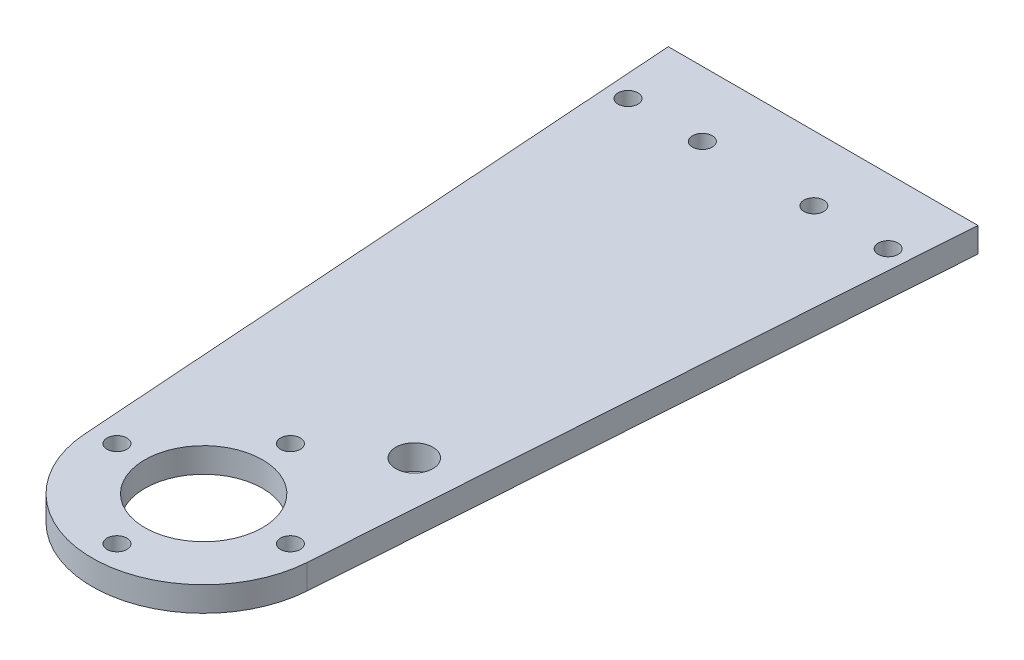
ISO-10303-21;
HEADER;
FILE_DESCRIPTION(('STEP AP214'),'2;1');
FILE_NAME('part.step','',(''),(''),'','','');
FILE_SCHEMA(('AUTOMOTIVE_DESIGN { 1 0 10303 214 1 1 1 1 }'));
ENDSEC;
DATA;
#1=APPLICATION_CONTEXT('core data for automotive mechanical design processes');
#2=APPLICATION_PROTOCOL_DEFINITION('international standard','automotive_design',2000,#1);
#3=PRODUCT_CONTEXT('',#1,'mechanical');
#4=PRODUCT('Part','Part','',(#3));
#5=PRODUCT_RELATED_PRODUCT_CATEGORY('part','',(#4));
#6=PRODUCT_DEFINITION_FORMATION('','',#4);
#7=PRODUCT_DEFINITION_CONTEXT('part definition',#1,'design');
#8=PRODUCT_DEFINITION('design','',#6,#7);
#9=PRODUCT_DEFINITION_SHAPE('','',#8);
#10=(LENGTH_UNIT() NAMED_UNIT(*) SI_UNIT(.MILLI.,.METRE.));
#11=(NAMED_UNIT(*) PLANE_ANGLE_UNIT() SI_UNIT($,.RADIAN.));
#12=(NAMED_UNIT(*) SI_UNIT($,.STERADIAN.) SOLID_ANGLE_UNIT());
#13=UNCERTAINTY_MEASURE_WITH_UNIT(LENGTH_MEASURE(1.E-05),#10,'distance_accuracy_value','');
#14=(GEOMETRIC_REPRESENTATION_CONTEXT(3) GLOBAL_UNCERTAINTY_ASSIGNED_CONTEXT((#13)) GLOBAL_UNIT_ASSIGNED_CONTEXT((#10,
#11,#12)) REPRESENTATION_CONTEXT('',''));
#15=CARTESIAN_POINT('',(0.,0.,0.));
#16=DIRECTION('',(0.,0.,1.));
#17=DIRECTION('',(1.,0.,0.));
#18=AXIS2_PLACEMENT_3D('',#15,#16,#17);
#19=CARTESIAN_POINT('',(0.,4.,0.));
#20=DIRECTION('',(0.,1.,0.));
#21=DIRECTION('',(0.,0.,-1.));
#22=AXIS2_PLACEMENT_3D('',#19,#20,#21);
#23=PLANE('',#22);
#24=CARTESIAN_POINT('',(-9.00000000000125,4.,-89.5));
#25=DIRECTION('',(0.,-1.,0.));
#26=DIRECTION('',(0.,0.,-1.));
#27=AXIS2_PLACEMENT_3D('',#24,#25,#26);
#28=CIRCLE('',#27,1.59999999999982);
#29=CARTESIAN_POINT('',(-9.00000000000125,4.,-91.0999999999999));
#30=VERTEX_POINT('',#29);
#31=EDGE_CURVE('E158',#30,#30,#28,.T.);
#32=ORIENTED_EDGE('',*,*,#31,.T.);
#33=EDGE_LOOP('',(#32));
#34=FACE_BOUND('',#33,.T.);
#35=CARTESIAN_POINT('',(20.9999999999977,4.,-89.5));
#36=DIRECTION('',(0.,-1.,0.));
#37=DIRECTION('',(0.,0.,-1.));
#38=AXIS2_PLACEMENT_3D('',#35,#36,#37);
#39=CIRCLE('',#38,1.59999999999982);
#40=CARTESIAN_POINT('',(20.9999999999977,4.,-91.0999999999999));
#41=VERTEX_POINT('',#40);
#42=EDGE_CURVE('E146',#41,#41,#39,.T.);
#43=ORIENTED_EDGE('',*,*,#42,.T.);
#44=EDGE_LOOP('',(#43));
#45=FACE_BOUND('',#44,.T.);
#46=CARTESIAN_POINT('',(-1.34766330039948E-12,4.,14.));
#47=DIRECTION('',(0.,-1.,0.));
#48=DIRECTION('',(0.,0.,-1.));
#49=AXIS2_PLACEMENT_3D('',#46,#47,#48);
#50=CIRCLE('',#49,1.59999999999982);
#51=CARTESIAN_POINT('',(-1.34766330039948E-12,4.,12.4000000000002));
#52=VERTEX_POINT('',#51);
#53=EDGE_CURVE('E134',#52,#52,#50,.T.);
#54=ORIENTED_EDGE('',*,*,#53,.T.);
#55=EDGE_LOOP('',(#54));
#56=FACE_BOUND('',#55,.T.);
#57=CARTESIAN_POINT('',(-4.59484880699357E-13,4.,-14.));
#58=DIRECTION('',(0.,-1.,0.));
#59=DIRECTION('',(0.,0.,-1.));
#60=AXIS2_PLACEMENT_3D('',#57,#58,#59);
#61=CIRCLE('',#60,1.59999999999982);
#62=CARTESIAN_POINT('',(-4.59484880699357E-13,4.,-15.5999999999998));
#63=VERTEX_POINT('',#62);
#64=EDGE_CURVE('E122',#63,#63,#61,.T.);
#65=ORIENTED_EDGE('',*,*,#64,.T.);
#66=EDGE_LOOP('',(#65));
#67=FACE_BOUND('',#66,.T.);
#68=CARTESIAN_POINT('',(0.,4.,0.));
#69=DIRECTION('',(0.,-1.,0.));
#70=DIRECTION('',(0.,0.,-1.));
#71=AXIS2_PLACEMENT_3D('',#68,#69,#70);
#72=CIRCLE('',#71,9.49999999999872);
#73=CARTESIAN_POINT('',(0.,4.,-9.49999999999872));
#74=VERTEX_POINT('',#73);
#75=EDGE_CURVE('E105',#74,#74,#72,.T.);
#76=ORIENTED_EDGE('',*,*,#75,.T.);
#77=EDGE_LOOP('',(#76));
#78=FACE_BOUND('',#77,.T.);
#79=CARTESIAN_POINT('',(0.,4.,0.));
#80=DIRECTION('',(0.,-1.,0.));
#81=DIRECTION('',(0.,0.,-1.));
#82=AXIS2_PLACEMENT_3D('',#79,#80,#81);
#83=CIRCLE('',#82,18.000000000004);
#84=CARTESIAN_POINT('',(17.9566038512915,4.,1.2491509628253));
#85=VERTEX_POINT('',#84);
#86=CARTESIAN_POINT('',(-17.9566038512915,4.,1.24915096282486));
#87=VERTEX_POINT('',#86);
#88=EDGE_CURVE('E93',#85,#87,#83,.T.);
#89=ORIENTED_EDGE('',*,*,#88,.F.);
#90=DIRECTION('',(-0.0693972757122852,0.,0.997589102849321));
#91=VECTOR('',#90,1.);
#92=CARTESIAN_POINT('',(17.9566038512915,4.,1.2491509628253));
#93=LINE('',#92,#91);
#94=CARTESIAN_POINT('',(24.9999999999995,4.,-99.9999999999996));
#95=VERTEX_POINT('',#94);
#96=EDGE_CURVE('E96',#95,#85,#93,.T.);
#97=ORIENTED_EDGE('',*,*,#96,.F.);
#98=DIRECTION('',(1.,0.,0.));
#99=VECTOR('',#98,1.);
#100=CARTESIAN_POINT('',(-25.0000000000013,4.,-99.9999999999996));
#101=LINE('',#100,#99);
#102=CARTESIAN_POINT('',(-25.0000000000013,4.,-99.9999999999996));
#103=VERTEX_POINT('',#102);
#104=EDGE_CURVE('E84',#103,#95,#101,.T.);
#105=ORIENTED_EDGE('',*,*,#104,.F.);
#106=DIRECTION('',(-0.0693972757123029,0.,-0.99758910284932));
#107=VECTOR('',#106,1.);
#108=CARTESIAN_POINT('',(-17.9566038512915,4.,1.24915096282486));
#109=LINE('',#108,#107);
#110=EDGE_CURVE('E89',#87,#103,#109,.T.);
#111=ORIENTED_EDGE('',*,*,#110,.F.);
#112=EDGE_LOOP('',(#89,#97,#105,#111));
#113=FACE_BOUND('',#112,.T.);
#114=CARTESIAN_POINT('',(-14.0000000000007,4.,-4.37150315946155E-13));
#115=DIRECTION('',(0.,-1.,0.));
#116=DIRECTION('',(0.,0.,-1.));
#117=AXIS2_PLACEMENT_3D('',#114,#115,#116);
#118=CIRCLE('',#117,1.59999999999982);
#119=CARTESIAN_POINT('',(-14.0000000000007,4.,-1.60000000000026));
#120=VERTEX_POINT('',#119);
#121=EDGE_CURVE('E116',#120,#120,#118,.T.);
#122=ORIENTED_EDGE('',*,*,#121,.T.);
#123=EDGE_LOOP('',(#122));
#124=FACE_BOUND('',#123,.T.);
#125=CARTESIAN_POINT('',(13.9999999999993,4.,4.5102810375397E-13));
#126=DIRECTION('',(0.,-1.,0.));
#127=DIRECTION('',(0.,0.,-1.));
#128=AXIS2_PLACEMENT_3D('',#125,#126,#127);
#129=CIRCLE('',#128,1.59999999999982);
#130=CARTESIAN_POINT('',(13.9999999999993,4.,-1.59999999999937));
#131=VERTEX_POINT('',#130);
#132=EDGE_CURVE('E128',#131,#131,#129,.T.);
#133=ORIENTED_EDGE('',*,*,#132,.T.);
#134=EDGE_LOOP('',(#133));
#135=FACE_BOUND('',#134,.T.);
#136=CARTESIAN_POINT('',(8.99999999999944,4.,-89.5));
#137=DIRECTION('',(0.,-1.,0.));
#138=DIRECTION('',(0.,0.,-1.));
#139=AXIS2_PLACEMENT_3D('',#136,#137,#138);
#140=CIRCLE('',#139,1.59999999999982);
#141=CARTESIAN_POINT('',(8.99999999999944,4.,-91.0999999999999));
#142=VERTEX_POINT('',#141);
#143=EDGE_CURVE('E140',#142,#142,#140,.T.);
#144=ORIENTED_EDGE('',*,*,#143,.T.);
#145=EDGE_LOOP('',(#144));
#146=FACE_BOUND('',#145,.T.);
#147=CARTESIAN_POINT('',(-21.0000000000021,4.,-89.5));
#148=DIRECTION('',(0.,-1.,0.));
#149=DIRECTION('',(0.,0.,-1.));
#150=AXIS2_PLACEMENT_3D('',#147,#148,#149);
#151=CIRCLE('',#150,1.59999999999982);
#152=CARTESIAN_POINT('',(-21.0000000000021,4.,-91.0999999999999));
#153=VERTEX_POINT('',#152);
#154=EDGE_CURVE('E152',#153,#153,#151,.T.);
#155=ORIENTED_EDGE('',*,*,#154,.T.);
#156=EDGE_LOOP('',(#155));
#157=FACE_BOUND('',#156,.T.);
#158=CARTESIAN_POINT('',(11.9999999999996,4.,-22.));
#159=DIRECTION('',(0.,-1.,0.));
#160=DIRECTION('',(0.,0.,-1.));
#161=AXIS2_PLACEMENT_3D('',#158,#159,#160);
#162=CIRCLE('',#161,3.00000000000011);
#163=CARTESIAN_POINT('',(11.9999999999996,4.,-25.0000000000001));
#164=VERTEX_POINT('',#163);
#165=EDGE_CURVE('E164',#164,#164,#162,.T.);
#166=ORIENTED_EDGE('',*,*,#165,.T.);
#167=EDGE_LOOP('',(#166));
#168=FACE_BOUND('',#167,.T.);
#169=ADVANCED_FACE('F37',(#34,#45,#56,#67,#78,#113,#124,#135,#146,#157,#168),#23,.T.);
#170=CARTESIAN_POINT('',(0.,0.,0.));
#171=DIRECTION('',(0.,1.,0.));
#172=DIRECTION('',(0.,0.,-1.));
#173=AXIS2_PLACEMENT_3D('',#170,#171,#172);
#174=PLANE('',#173);
#175=CARTESIAN_POINT('',(0.,0.,0.));
#176=DIRECTION('',(0.,-1.,0.));
#177=DIRECTION('',(0.,0.,-1.));
#178=AXIS2_PLACEMENT_3D('',#175,#176,#177);
#179=CIRCLE('',#178,18.000000000004);
#180=CARTESIAN_POINT('',(17.9566038512915,0.,1.2491509628253));
#181=VERTEX_POINT('',#180);
#182=CARTESIAN_POINT('',(-17.9566038512915,0.,1.24915096282486));
#183=VERTEX_POINT('',#182);
#184=EDGE_CURVE('E101',#181,#183,#179,.T.);
#185=ORIENTED_EDGE('',*,*,#184,.T.);
#186=DIRECTION('',(-0.0693972757123029,0.,-0.99758910284932));
#187=VECTOR('',#186,1.);
#188=CARTESIAN_POINT('',(-17.9566038512915,0.,1.24915096282486));
#189=LINE('',#188,#187);
#190=CARTESIAN_POINT('',(-25.0000000000013,0.,-99.9999999999996));
#191=VERTEX_POINT('',#190);
#192=EDGE_CURVE('E104',#183,#191,#189,.T.);
#193=ORIENTED_EDGE('',*,*,#192,.T.);
#194=DIRECTION('',(1.,0.,0.));
#195=VECTOR('',#194,1.);
#196=CARTESIAN_POINT('',(-25.0000000000013,0.,-99.9999999999996));
#197=LINE('',#196,#195);
#198=CARTESIAN_POINT('',(24.9999999999995,0.,-99.9999999999996));
#199=VERTEX_POINT('',#198);
#200=EDGE_CURVE('E87',#191,#199,#197,.T.);
#201=ORIENTED_EDGE('',*,*,#200,.T.);
#202=DIRECTION('',(-0.0693972757122852,0.,0.997589102849321));
#203=VECTOR('',#202,1.);
#204=CARTESIAN_POINT('',(17.9566038512915,0.,1.2491509628253));
#205=LINE('',#204,#203);
#206=EDGE_CURVE('E108',#199,#181,#205,.T.);
#207=ORIENTED_EDGE('',*,*,#206,.T.);
#208=EDGE_LOOP('',(#185,#193,#201,#207));
#209=FACE_BOUND('',#208,.T.);
#210=CARTESIAN_POINT('',(0.,0.,0.));
#211=DIRECTION('',(0.,-1.,0.));
#212=DIRECTION('',(0.,0.,-1.));
#213=AXIS2_PLACEMENT_3D('',#210,#211,#212);
#214=CIRCLE('',#213,9.49999999999872);
#215=CARTESIAN_POINT('',(0.,0.,-9.49999999999872));
#216=VERTEX_POINT('',#215);
#217=EDGE_CURVE('E113',#216,#216,#214,.T.);
#218=ORIENTED_EDGE('',*,*,#217,.F.);
#219=EDGE_LOOP('',(#218));
#220=FACE_BOUND('',#219,.T.);
#221=CARTESIAN_POINT('',(-14.0000000000007,0.,-4.37150315946155E-13));
#222=DIRECTION('',(0.,-1.,0.));
#223=DIRECTION('',(0.,0.,-1.));
#224=AXIS2_PLACEMENT_3D('',#221,#222,#223);
#225=CIRCLE('',#224,1.59999999999982);
#226=CARTESIAN_POINT('',(-14.0000000000007,0.,-1.60000000000026));
#227=VERTEX_POINT('',#226);
#228=EDGE_CURVE('E119',#227,#227,#225,.T.);
#229=ORIENTED_EDGE('',*,*,#228,.F.);
#230=EDGE_LOOP('',(#229));
#231=FACE_BOUND('',#230,.T.);
#232=CARTESIAN_POINT('',(-4.59484880699357E-13,0.,-14.));
#233=DIRECTION('',(0.,-1.,0.));
#234=DIRECTION('',(0.,0.,-1.));
#235=AXIS2_PLACEMENT_3D('',#232,#233,#234);
#236=CIRCLE('',#235,1.59999999999982);
#237=CARTESIAN_POINT('',(-4.59484880699357E-13,0.,-15.5999999999998));
#238=VERTEX_POINT('',#237);
#239=EDGE_CURVE('E125',#238,#238,#236,.T.);
#240=ORIENTED_EDGE('',*,*,#239,.F.);
#241=EDGE_LOOP('',(#240));
#242=FACE_BOUND('',#241,.T.);
#243=CARTESIAN_POINT('',(13.9999999999993,0.,4.5102810375397E-13));
#244=DIRECTION('',(0.,-1.,0.));
#245=DIRECTION('',(0.,0.,-1.));
#246=AXIS2_PLACEMENT_3D('',#243,#244,#245);
#247=CIRCLE('',#246,1.59999999999982);
#248=CARTESIAN_POINT('',(13.9999999999993,0.,-1.59999999999937));
#249=VERTEX_POINT('',#248);
#250=EDGE_CURVE('E131',#249,#249,#247,.T.);
#251=ORIENTED_EDGE('',*,*,#250,.F.);
#252=EDGE_LOOP('',(#251));
#253=FACE_BOUND('',#252,.T.);
#254=CARTESIAN_POINT('',(-1.34766330039948E-12,0.,14.));
#255=DIRECTION('',(0.,-1.,0.));
#256=DIRECTION('',(0.,0.,-1.));
#257=AXIS2_PLACEMENT_3D('',#254,#255,#256);
#258=CIRCLE('',#257,1.59999999999982);
#259=CARTESIAN_POINT('',(-1.34766330039948E-12,0.,12.4000000000002));
#260=VERTEX_POINT('',#259);
#261=EDGE_CURVE('E137',#260,#260,#258,.T.);
#262=ORIENTED_EDGE('',*,*,#261,.F.);
#263=EDGE_LOOP('',(#262));
#264=FACE_BOUND('',#263,.T.);
#265=CARTESIAN_POINT('',(8.99999999999944,0.,-89.5));
#266=DIRECTION('',(0.,-1.,0.));
#267=DIRECTION('',(0.,0.,-1.));
#268=AXIS2_PLACEMENT_3D('',#265,#266,#267);
#269=CIRCLE('',#268,1.59999999999982);
#270=CARTESIAN_POINT('',(8.99999999999944,0.,-91.0999999999999));
#271=VERTEX_POINT('',#270);
#272=EDGE_CURVE('E143',#271,#271,#269,.T.);
#273=ORIENTED_EDGE('',*,*,#272,.F.);
#274=EDGE_LOOP('',(#273));
#275=FACE_BOUND('',#274,.T.);
#276=CARTESIAN_POINT('',(20.9999999999977,0.,-89.5));
#277=DIRECTION('',(0.,-1.,0.));
#278=DIRECTION('',(0.,0.,-1.));
#279=AXIS2_PLACEMENT_3D('',#276,#277,#278);
#280=CIRCLE('',#279,1.59999999999982);
#281=CARTESIAN_POINT('',(20.9999999999977,0.,-91.0999999999999));
#282=VERTEX_POINT('',#281);
#283=EDGE_CURVE('E149',#282,#282,#280,.T.);
#284=ORIENTED_EDGE('',*,*,#283,.F.);
#285=EDGE_LOOP('',(#284));
#286=FACE_BOUND('',#285,.T.);
#287=CARTESIAN_POINT('',(-21.0000000000021,0.,-89.5));
#288=DIRECTION('',(0.,-1.,0.));
#289=DIRECTION('',(0.,0.,-1.));
#290=AXIS2_PLACEMENT_3D('',#287,#288,#289);
#291=CIRCLE('',#290,1.59999999999982);
#292=CARTESIAN_POINT('',(-21.0000000000021,0.,-91.0999999999999));
#293=VERTEX_POINT('',#292);
#294=EDGE_CURVE('E155',#293,#293,#291,.T.);
#295=ORIENTED_EDGE('',*,*,#294,.F.);
#296=EDGE_LOOP('',(#295));
#297=FACE_BOUND('',#296,.T.);
#298=CARTESIAN_POINT('',(-9.00000000000125,0.,-89.5));
#299=DIRECTION('',(0.,-1.,0.));
#300=DIRECTION('',(0.,0.,-1.));
#301=AXIS2_PLACEMENT_3D('',#298,#299,#300);
#302=CIRCLE('',#301,1.59999999999982);
#303=CARTESIAN_POINT('',(-9.00000000000125,0.,-91.0999999999999));
#304=VERTEX_POINT('',#303);
#305=EDGE_CURVE('E161',#304,#304,#302,.T.);
#306=ORIENTED_EDGE('',*,*,#305,.F.);
#307=EDGE_LOOP('',(#306));
#308=FACE_BOUND('',#307,.T.);
#309=CARTESIAN_POINT('',(11.9999999999996,0.,-22.));
#310=DIRECTION('',(0.,-1.,0.));
#311=DIRECTION('',(0.,0.,-1.));
#312=AXIS2_PLACEMENT_3D('',#309,#310,#311);
#313=CIRCLE('',#312,3.00000000000011);
#314=CARTESIAN_POINT('',(11.9999999999996,0.,-25.0000000000001));
#315=VERTEX_POINT('',#314);
#316=EDGE_CURVE('E167',#315,#315,#313,.T.);
#317=ORIENTED_EDGE('',*,*,#316,.F.);
#318=EDGE_LOOP('',(#317));
#319=FACE_BOUND('',#318,.T.);
#320=ADVANCED_FACE('F181',(#209,#220,#231,#242,#253,#264,#275,#286,#297,#308,#319),#174,.F.);
#321=CARTESIAN_POINT('',(0.,4.,0.));
#322=DIRECTION('',(0.,-1.,0.));
#323=DIRECTION('',(0.,0.,1.));
#324=AXIS2_PLACEMENT_3D('',#321,#322,#323);
#325=CYLINDRICAL_SURFACE('',#324,18.000000000004);
#326=ORIENTED_EDGE('',*,*,#184,.F.);
#327=DIRECTION('',(0.,-1.,0.));
#328=VECTOR('',#327,1.);
#329=CARTESIAN_POINT('',(17.9566038512915,4.,1.2491509628253));
#330=LINE('',#329,#328);
#331=EDGE_CURVE('E54',#85,#181,#330,.T.);
#332=ORIENTED_EDGE('',*,*,#331,.F.);
#333=ORIENTED_EDGE('',*,*,#88,.T.);
#334=DIRECTION('',(0.,-1.,0.));
#335=VECTOR('',#334,1.);
#336=CARTESIAN_POINT('',(-17.9566038512915,4.,1.24915096282486));
#337=LINE('',#336,#335);
#338=EDGE_CURVE('E11',#87,#183,#337,.T.);
#339=ORIENTED_EDGE('',*,*,#338,.T.);
#340=EDGE_LOOP('',(#326,#332,#333,#339));
#341=FACE_BOUND('',#340,.T.);
#342=ADVANCED_FACE('F39',(#341),#325,.T.);
#343=CARTESIAN_POINT('',(-17.9566038512915,4.,1.24915096282486));
#344=DIRECTION('',(0.99758910284932,0.,-0.0693972757123029));
#345=DIRECTION('',(0.0693972757123029,0.,0.99758910284932));
#346=AXIS2_PLACEMENT_3D('',#343,#344,#345);
#347=PLANE('',#346);
#348=ORIENTED_EDGE('',*,*,#192,.F.);
#349=ORIENTED_EDGE('',*,*,#338,.F.);
#350=ORIENTED_EDGE('',*,*,#110,.T.);
#351=DIRECTION('',(0.,-1.,0.));
#352=VECTOR('',#351,1.);
#353=CARTESIAN_POINT('',(-25.0000000000013,4.,-99.9999999999996));
#354=LINE('',#353,#352);
#355=EDGE_CURVE('E46',#103,#191,#354,.T.);
#356=ORIENTED_EDGE('',*,*,#355,.T.);
#357=EDGE_LOOP('',(#348,#349,#350,#356));
#358=FACE_BOUND('',#357,.T.);
#359=ADVANCED_FACE('F90',(#358),#347,.F.);
#360=CARTESIAN_POINT('',(-25.0000000000013,4.,-99.9999999999996));
#361=DIRECTION('',(0.,0.,1.));
#362=DIRECTION('',(-1.,0.,0.));
#363=AXIS2_PLACEMENT_3D('',#360,#361,#362);
#364=PLANE('',#363);
#365=ORIENTED_EDGE('',*,*,#200,.F.);
#366=ORIENTED_EDGE('',*,*,#355,.F.);
#367=ORIENTED_EDGE('',*,*,#104,.T.);
#368=DIRECTION('',(0.,-1.,0.));
#369=VECTOR('',#368,1.);
#370=CARTESIAN_POINT('',(24.9999999999995,4.,-99.9999999999996));
#371=LINE('',#370,#369);
#372=EDGE_CURVE('E70',#95,#199,#371,.T.);
#373=ORIENTED_EDGE('',*,*,#372,.T.);
#374=EDGE_LOOP('',(#365,#366,#367,#373));
#375=FACE_BOUND('',#374,.T.);
#376=ADVANCED_FACE('F82',(#375),#364,.F.);
#377=CARTESIAN_POINT('',(17.9566038512915,4.,1.2491509628253));
#378=DIRECTION('',(-0.997589102849321,0.,-0.0693972757122852));
#379=DIRECTION('',(0.0693972757122852,0.,-0.997589102849321));
#380=AXIS2_PLACEMENT_3D('',#377,#378,#379);
#381=PLANE('',#380);
#382=ORIENTED_EDGE('',*,*,#206,.F.);
#383=ORIENTED_EDGE('',*,*,#372,.F.);
#384=ORIENTED_EDGE('',*,*,#96,.T.);
#385=ORIENTED_EDGE('',*,*,#331,.T.);
#386=EDGE_LOOP('',(#382,#383,#384,#385));
#387=FACE_BOUND('',#386,.T.);
#388=ADVANCED_FACE('F193',(#387),#381,.F.);
#389=CARTESIAN_POINT('',(0.,4.,0.));
#390=DIRECTION('',(0.,-1.,0.));
#391=DIRECTION('',(0.,0.,1.));
#392=AXIS2_PLACEMENT_3D('',#389,#390,#391);
#393=CYLINDRICAL_SURFACE('',#392,9.49999999999872);
#394=ORIENTED_EDGE('',*,*,#75,.F.);
#395=EDGE_LOOP('',(#394));
#396=FACE_BOUND('',#395,.T.);
#397=ORIENTED_EDGE('',*,*,#217,.T.);
#398=EDGE_LOOP('',(#397));
#399=FACE_BOUND('',#398,.T.);
#400=ADVANCED_FACE('F196',(#396,#399),#393,.F.);
#401=CARTESIAN_POINT('',(-14.0000000000007,4.,-4.37150315946155E-13));
#402=DIRECTION('',(0.,-1.,0.));
#403=DIRECTION('',(0.,0.,1.));
#404=AXIS2_PLACEMENT_3D('',#401,#402,#403);
#405=CYLINDRICAL_SURFACE('',#404,1.59999999999982);
#406=ORIENTED_EDGE('',*,*,#121,.F.);
#407=EDGE_LOOP('',(#406));
#408=FACE_BOUND('',#407,.T.);
#409=ORIENTED_EDGE('',*,*,#228,.T.);
#410=EDGE_LOOP('',(#409));
#411=FACE_BOUND('',#410,.T.);
#412=ADVANCED_FACE('F217',(#408,#411),#405,.F.);
#413=CARTESIAN_POINT('',(-4.59484880699357E-13,4.,-14.));
#414=DIRECTION('',(0.,-1.,0.));
#415=DIRECTION('',(0.,0.,1.));
#416=AXIS2_PLACEMENT_3D('',#413,#414,#415);
#417=CYLINDRICAL_SURFACE('',#416,1.59999999999982);
#418=ORIENTED_EDGE('',*,*,#64,.F.);
#419=EDGE_LOOP('',(#418));
#420=FACE_BOUND('',#419,.T.);
#421=ORIENTED_EDGE('',*,*,#239,.T.);
#422=EDGE_LOOP('',(#421));
#423=FACE_BOUND('',#422,.T.);
#424=ADVANCED_FACE('F224',(#420,#423),#417,.F.);
#425=CARTESIAN_POINT('',(13.9999999999993,4.,4.5102810375397E-13));
#426=DIRECTION('',(0.,-1.,0.));
#427=DIRECTION('',(0.,0.,1.));
#428=AXIS2_PLACEMENT_3D('',#425,#426,#427);
#429=CYLINDRICAL_SURFACE('',#428,1.59999999999982);
#430=ORIENTED_EDGE('',*,*,#132,.F.);
#431=EDGE_LOOP('',(#430));
#432=FACE_BOUND('',#431,.T.);
#433=ORIENTED_EDGE('',*,*,#250,.T.);
#434=EDGE_LOOP('',(#433));
#435=FACE_BOUND('',#434,.T.);
#436=ADVANCED_FACE('F232',(#432,#435),#429,.F.);
#437=CARTESIAN_POINT('',(-1.34766330039948E-12,4.,14.));
#438=DIRECTION('',(0.,-1.,0.));
#439=DIRECTION('',(0.,0.,1.));
#440=AXIS2_PLACEMENT_3D('',#437,#438,#439);
#441=CYLINDRICAL_SURFACE('',#440,1.59999999999982);
#442=ORIENTED_EDGE('',*,*,#53,.F.);
#443=EDGE_LOOP('',(#442));
#444=FACE_BOUND('',#443,.T.);
#445=ORIENTED_EDGE('',*,*,#261,.T.);
#446=EDGE_LOOP('',(#445));
#447=FACE_BOUND('',#446,.T.);
#448=ADVANCED_FACE('F240',(#444,#447),#441,.F.);
#449=CARTESIAN_POINT('',(8.99999999999944,4.,-89.5));
#450=DIRECTION('',(0.,-1.,0.));
#451=DIRECTION('',(0.,0.,1.));
#452=AXIS2_PLACEMENT_3D('',#449,#450,#451);
#453=CYLINDRICAL_SURFACE('',#452,1.59999999999982);
#454=ORIENTED_EDGE('',*,*,#143,.F.);
#455=EDGE_LOOP('',(#454));
#456=FACE_BOUND('',#455,.T.);
#457=ORIENTED_EDGE('',*,*,#272,.T.);
#458=EDGE_LOOP('',(#457));
#459=FACE_BOUND('',#458,.T.);
#460=ADVANCED_FACE('F248',(#456,#459),#453,.F.);
#461=CARTESIAN_POINT('',(20.9999999999977,4.,-89.5));
#462=DIRECTION('',(0.,-1.,0.));
#463=DIRECTION('',(0.,0.,1.));
#464=AXIS2_PLACEMENT_3D('',#461,#462,#463);
#465=CYLINDRICAL_SURFACE('',#464,1.59999999999982);
#466=ORIENTED_EDGE('',*,*,#42,.F.);
#467=EDGE_LOOP('',(#466));
#468=FACE_BOUND('',#467,.T.);
#469=ORIENTED_EDGE('',*,*,#283,.T.);
#470=EDGE_LOOP('',(#469));
#471=FACE_BOUND('',#470,.T.);
#472=ADVANCED_FACE('F256',(#468,#471),#465,.F.);
#473=CARTESIAN_POINT('',(-21.0000000000021,4.,-89.5));
#474=DIRECTION('',(0.,-1.,0.));
#475=DIRECTION('',(0.,0.,1.));
#476=AXIS2_PLACEMENT_3D('',#473,#474,#475);
#477=CYLINDRICAL_SURFACE('',#476,1.59999999999982);
#478=ORIENTED_EDGE('',*,*,#154,.F.);
#479=EDGE_LOOP('',(#478));
#480=FACE_BOUND('',#479,.T.);
#481=ORIENTED_EDGE('',*,*,#294,.T.);
#482=EDGE_LOOP('',(#481));
#483=FACE_BOUND('',#482,.T.);
#484=ADVANCED_FACE('F264',(#480,#483),#477,.F.);
#485=CARTESIAN_POINT('',(-9.00000000000125,4.,-89.5));
#486=DIRECTION('',(0.,-1.,0.));
#487=DIRECTION('',(0.,0.,1.));
#488=AXIS2_PLACEMENT_3D('',#485,#486,#487);
#489=CYLINDRICAL_SURFACE('',#488,1.59999999999982);
#490=ORIENTED_EDGE('',*,*,#31,.F.);
#491=EDGE_LOOP('',(#490));
#492=FACE_BOUND('',#491,.T.);
#493=ORIENTED_EDGE('',*,*,#305,.T.);
#494=EDGE_LOOP('',(#493));
#495=FACE_BOUND('',#494,.T.);
#496=ADVANCED_FACE('F177',(#492,#495),#489,.F.);
#497=CARTESIAN_POINT('',(11.9999999999996,4.,-22.));
#498=DIRECTION('',(0.,-1.,0.));
#499=DIRECTION('',(0.,0.,1.));
#500=AXIS2_PLACEMENT_3D('',#497,#498,#499);
#501=CYLINDRICAL_SURFACE('',#500,3.00000000000011);
#502=ORIENTED_EDGE('',*,*,#165,.F.);
#503=EDGE_LOOP('',(#502));
#504=FACE_BOUND('',#503,.T.);
#505=ORIENTED_EDGE('',*,*,#316,.T.);
#506=EDGE_LOOP('',(#505));
#507=FACE_BOUND('',#506,.T.);
#508=ADVANCED_FACE('F174',(#504,#507),#501,.F.);
#509=CLOSED_SHELL('',(#169,#320,#342,#359,#376,#388,#400,#412,#424,#436,#448,#460,#472,#484,
#496,#508));
#510=MANIFOLD_SOLID_BREP('B2',#509);
#511=ADVANCED_BREP_SHAPE_REPRESENTATION('',(#18,#510),#14);
#512=SHAPE_DEFINITION_REPRESENTATION(#9,#511);
ENDSEC;
END-ISO-10303-21;
